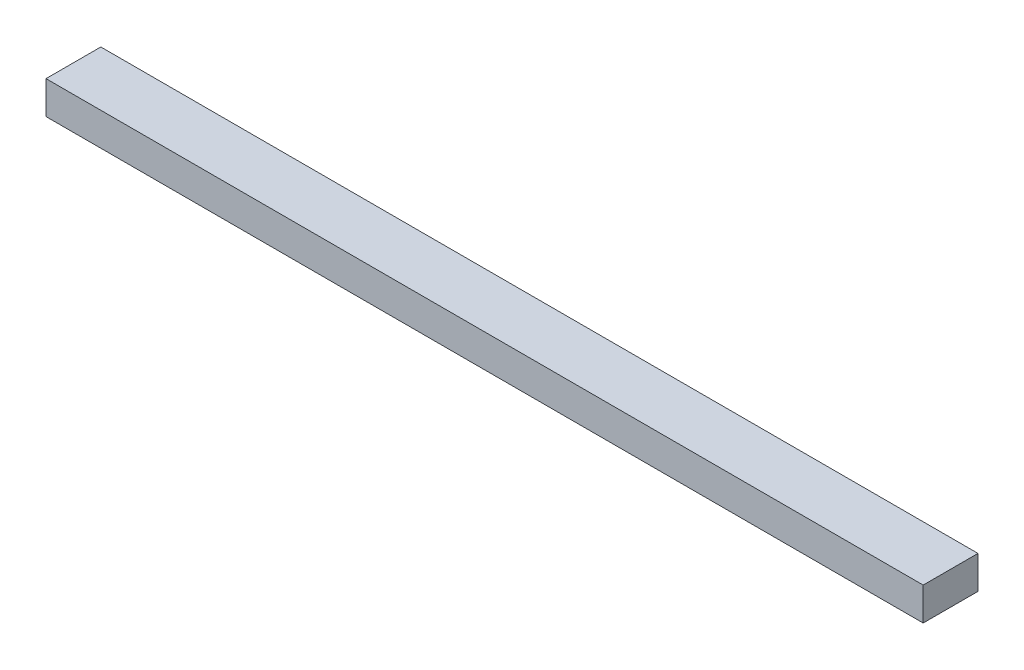
ISO-10303-21;
HEADER;
FILE_DESCRIPTION(('STEP AP214'),'2;1');
FILE_NAME('part.step','',(''),(''),'','','');
FILE_SCHEMA(('AUTOMOTIVE_DESIGN { 1 0 10303 214 1 1 1 1 }'));
ENDSEC;
DATA;
#1=APPLICATION_CONTEXT('core data for automotive mechanical design processes');
#2=APPLICATION_PROTOCOL_DEFINITION('international standard','automotive_design',2000,#1);
#3=PRODUCT_CONTEXT('',#1,'mechanical');
#4=PRODUCT('Part','Part','',(#3));
#5=PRODUCT_RELATED_PRODUCT_CATEGORY('part','',(#4));
#6=PRODUCT_DEFINITION_FORMATION('','',#4);
#7=PRODUCT_DEFINITION_CONTEXT('part definition',#1,'design');
#8=PRODUCT_DEFINITION('design','',#6,#7);
#9=PRODUCT_DEFINITION_SHAPE('','',#8);
#10=(LENGTH_UNIT() NAMED_UNIT(*) SI_UNIT(.MILLI.,.METRE.));
#11=(NAMED_UNIT(*) PLANE_ANGLE_UNIT() SI_UNIT($,.RADIAN.));
#12=(NAMED_UNIT(*) SI_UNIT($,.STERADIAN.) SOLID_ANGLE_UNIT());
#13=UNCERTAINTY_MEASURE_WITH_UNIT(LENGTH_MEASURE(1.E-05),#10,'distance_accuracy_value','');
#14=(GEOMETRIC_REPRESENTATION_CONTEXT(3) GLOBAL_UNCERTAINTY_ASSIGNED_CONTEXT((#13)) GLOBAL_UNIT_ASSIGNED_CONTEXT((#10,
#11,#12)) REPRESENTATION_CONTEXT('',''));
#15=CARTESIAN_POINT('',(0.,0.,0.));
#16=DIRECTION('',(0.,0.,1.));
#17=DIRECTION('',(1.,0.,0.));
#18=AXIS2_PLACEMENT_3D('',#15,#16,#17);
#19=CARTESIAN_POINT('',(-2.875,0.437499999999999,5.));
#20=DIRECTION('',(1.,0.,0.));
#21=DIRECTION('',(0.,1.,0.));
#22=AXIS2_PLACEMENT_3D('',#19,#20,#21);
#23=PLANE('',#22);
#24=DIRECTION('',(0.,-1.,0.));
#25=VECTOR('',#24,1.);
#26=CARTESIAN_POINT('',(-2.875,0.437499999999999,0.));
#27=LINE('',#26,#25);
#28=CARTESIAN_POINT('',(-2.875,0.437499999999999,0.));
#29=VERTEX_POINT('',#28);
#30=CARTESIAN_POINT('',(-2.875,-2.5625,0.));
#31=VERTEX_POINT('',#30);
#32=EDGE_CURVE('E99',#29,#31,#27,.T.);
#33=ORIENTED_EDGE('',*,*,#32,.T.);
#34=DIRECTION('',(0.,0.,-1.));
#35=VECTOR('',#34,1.);
#36=CARTESIAN_POINT('',(-2.875,-2.5625,5.));
#37=LINE('',#36,#35);
#38=CARTESIAN_POINT('',(-2.875,-2.5625,5.));
#39=VERTEX_POINT('',#38);
#40=EDGE_CURVE('E11',#39,#31,#37,.T.);
#41=ORIENTED_EDGE('',*,*,#40,.F.);
#42=DIRECTION('',(0.,-1.,0.));
#43=VECTOR('',#42,1.);
#44=CARTESIAN_POINT('',(-2.875,0.437499999999999,5.));
#45=LINE('',#44,#43);
#46=CARTESIAN_POINT('',(-2.875,0.437499999999999,5.));
#47=VERTEX_POINT('',#46);
#48=EDGE_CURVE('E87',#47,#39,#45,.T.);
#49=ORIENTED_EDGE('',*,*,#48,.F.);
#50=DIRECTION('',(0.,0.,-1.));
#51=VECTOR('',#50,1.);
#52=CARTESIAN_POINT('',(-2.875,0.437499999999999,5.));
#53=LINE('',#52,#51);
#54=EDGE_CURVE('E95',#47,#29,#53,.T.);
#55=ORIENTED_EDGE('',*,*,#54,.T.);
#56=EDGE_LOOP('',(#33,#41,#49,#55));
#57=FACE_BOUND('',#56,.T.);
#58=ADVANCED_FACE('F36',(#57),#23,.F.);
#59=CARTESIAN_POINT('',(-2.875,-2.5625,5.));
#60=DIRECTION('',(0.,1.,0.));
#61=DIRECTION('',(0.,0.,1.));
#62=AXIS2_PLACEMENT_3D('',#59,#60,#61);
#63=PLANE('',#62);
#64=DIRECTION('',(1.,0.,0.));
#65=VECTOR('',#64,1.);
#66=CARTESIAN_POINT('',(-2.875,-2.5625,0.));
#67=LINE('',#66,#65);
#68=CARTESIAN_POINT('',(77.125,-2.5625,0.));
#69=VERTEX_POINT('',#68);
#70=EDGE_CURVE('E91',#31,#69,#67,.T.);
#71=ORIENTED_EDGE('',*,*,#70,.T.);
#72=DIRECTION('',(0.,0.,-1.));
#73=VECTOR('',#72,1.);
#74=CARTESIAN_POINT('',(77.125,-2.5625,5.));
#75=LINE('',#74,#73);
#76=CARTESIAN_POINT('',(77.125,-2.5625,5.));
#77=VERTEX_POINT('',#76);
#78=EDGE_CURVE('E44',#77,#69,#75,.T.);
#79=ORIENTED_EDGE('',*,*,#78,.F.);
#80=DIRECTION('',(1.,0.,0.));
#81=VECTOR('',#80,1.);
#82=CARTESIAN_POINT('',(-2.875,-2.5625,5.));
#83=LINE('',#82,#81);
#84=EDGE_CURVE('E82',#39,#77,#83,.T.);
#85=ORIENTED_EDGE('',*,*,#84,.F.);
#86=ORIENTED_EDGE('',*,*,#40,.T.);
#87=EDGE_LOOP('',(#71,#79,#85,#86));
#88=FACE_BOUND('',#87,.T.);
#89=ADVANCED_FACE('F90',(#88),#63,.F.);
#90=CARTESIAN_POINT('',(77.125,0.437499999999999,5.));
#91=DIRECTION('',(-1.,0.,0.));
#92=DIRECTION('',(0.,0.,1.));
#93=AXIS2_PLACEMENT_3D('',#90,#91,#92);
#94=PLANE('',#93);
#95=DIRECTION('',(0.,1.,0.));
#96=VECTOR('',#95,1.);
#97=CARTESIAN_POINT('',(77.125,0.437499999999999,0.));
#98=LINE('',#97,#96);
#99=CARTESIAN_POINT('',(77.125,0.437499999999999,0.));
#100=VERTEX_POINT('',#99);
#101=EDGE_CURVE('E69',#69,#100,#98,.T.);
#102=ORIENTED_EDGE('',*,*,#101,.T.);
#103=DIRECTION('',(0.,0.,-1.));
#104=VECTOR('',#103,1.);
#105=CARTESIAN_POINT('',(77.125,0.437499999999999,5.));
#106=LINE('',#105,#104);
#107=CARTESIAN_POINT('',(77.125,0.437499999999999,5.));
#108=VERTEX_POINT('',#107);
#109=EDGE_CURVE('E92',#108,#100,#106,.T.);
#110=ORIENTED_EDGE('',*,*,#109,.F.);
#111=DIRECTION('',(0.,1.,0.));
#112=VECTOR('',#111,1.);
#113=CARTESIAN_POINT('',(77.125,0.437499999999999,5.));
#114=LINE('',#113,#112);
#115=EDGE_CURVE('E85',#77,#108,#114,.T.);
#116=ORIENTED_EDGE('',*,*,#115,.F.);
#117=ORIENTED_EDGE('',*,*,#78,.T.);
#118=EDGE_LOOP('',(#102,#110,#116,#117));
#119=FACE_BOUND('',#118,.T.);
#120=ADVANCED_FACE('F93',(#119),#94,.F.);
#121=CARTESIAN_POINT('',(-2.875,0.437499999999999,5.));
#122=DIRECTION('',(0.,-1.,0.));
#123=DIRECTION('',(0.,0.,-1.));
#124=AXIS2_PLACEMENT_3D('',#121,#122,#123);
#125=PLANE('',#124);
#126=DIRECTION('',(-1.,0.,0.));
#127=VECTOR('',#126,1.);
#128=CARTESIAN_POINT('',(-2.875,0.437499999999999,0.));
#129=LINE('',#128,#127);
#130=EDGE_CURVE('E75',#100,#29,#129,.T.);
#131=ORIENTED_EDGE('',*,*,#130,.T.);
#132=ORIENTED_EDGE('',*,*,#54,.F.);
#133=DIRECTION('',(-1.,0.,0.));
#134=VECTOR('',#133,1.);
#135=CARTESIAN_POINT('',(-2.875,0.437499999999999,5.));
#136=LINE('',#135,#134);
#137=EDGE_CURVE('E52',#108,#47,#136,.T.);
#138=ORIENTED_EDGE('',*,*,#137,.F.);
#139=ORIENTED_EDGE('',*,*,#109,.T.);
#140=EDGE_LOOP('',(#131,#132,#138,#139));
#141=FACE_BOUND('',#140,.T.);
#142=ADVANCED_FACE('F106',(#141),#125,.F.);
#143=CARTESIAN_POINT('',(0.,0.,5.));
#144=DIRECTION('',(0.,0.,1.));
#145=DIRECTION('',(1.,0.,0.));
#146=AXIS2_PLACEMENT_3D('',#143,#144,#145);
#147=PLANE('',#146);
#148=ORIENTED_EDGE('',*,*,#48,.T.);
#149=ORIENTED_EDGE('',*,*,#84,.T.);
#150=ORIENTED_EDGE('',*,*,#115,.T.);
#151=ORIENTED_EDGE('',*,*,#137,.T.);
#152=EDGE_LOOP('',(#148,#149,#150,#151));
#153=FACE_BOUND('',#152,.T.);
#154=ADVANCED_FACE('F83',(#153),#147,.T.);
#155=CARTESIAN_POINT('',(0.,0.,0.));
#156=DIRECTION('',(0.,0.,1.));
#157=DIRECTION('',(1.,0.,0.));
#158=AXIS2_PLACEMENT_3D('',#155,#156,#157);
#159=PLANE('',#158);
#160=ORIENTED_EDGE('',*,*,#32,.F.);
#161=ORIENTED_EDGE('',*,*,#130,.F.);
#162=ORIENTED_EDGE('',*,*,#101,.F.);
#163=ORIENTED_EDGE('',*,*,#70,.F.);
#164=EDGE_LOOP('',(#160,#161,#162,#163));
#165=FACE_BOUND('',#164,.T.);
#166=ADVANCED_FACE('F109',(#165),#159,.F.);
#167=CLOSED_SHELL('',(#58,#89,#120,#142,#154,#166));
#168=MANIFOLD_SOLID_BREP('B2',#167);
#169=ADVANCED_BREP_SHAPE_REPRESENTATION('',(#18,#168),#14);
#170=SHAPE_DEFINITION_REPRESENTATION(#9,#169);
ENDSEC;
END-ISO-10303-21;
